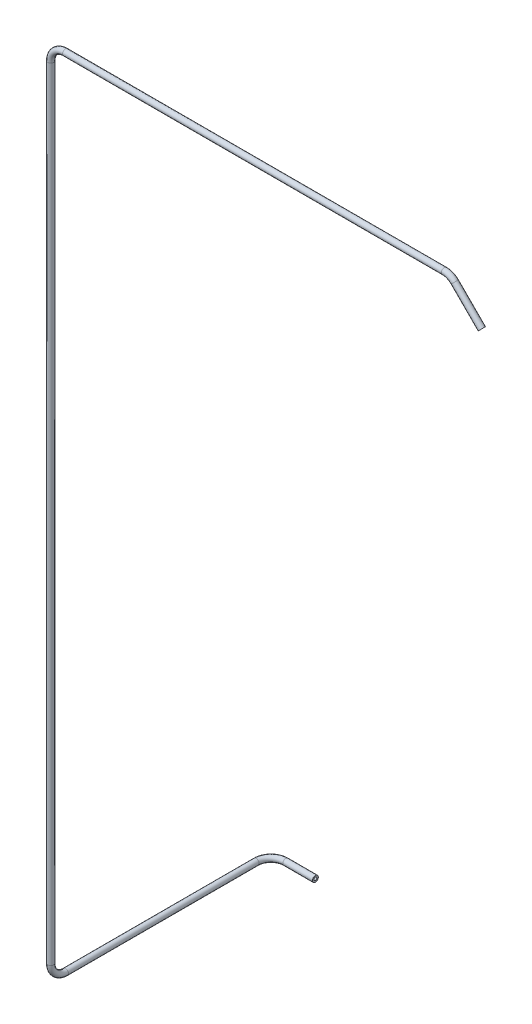
ISO-10303-21;
HEADER;
FILE_DESCRIPTION(('STEP AP214'),'2;1');
FILE_NAME('part.step','',(''),(''),'','','');
FILE_SCHEMA(('AUTOMOTIVE_DESIGN { 1 0 10303 214 1 1 1 1 }'));
ENDSEC;
DATA;
#1=APPLICATION_CONTEXT('core data for automotive mechanical design processes');
#2=APPLICATION_PROTOCOL_DEFINITION('international standard','automotive_design',2000,#1);
#3=PRODUCT_CONTEXT('',#1,'mechanical');
#4=PRODUCT('Part','Part','',(#3));
#5=PRODUCT_RELATED_PRODUCT_CATEGORY('part','',(#4));
#6=PRODUCT_DEFINITION_FORMATION('','',#4);
#7=PRODUCT_DEFINITION_CONTEXT('part definition',#1,'design');
#8=PRODUCT_DEFINITION('design','',#6,#7);
#9=PRODUCT_DEFINITION_SHAPE('','',#8);
#10=(LENGTH_UNIT() NAMED_UNIT(*) SI_UNIT(.MILLI.,.METRE.));
#11=(NAMED_UNIT(*) PLANE_ANGLE_UNIT() SI_UNIT($,.RADIAN.));
#12=(NAMED_UNIT(*) SI_UNIT($,.STERADIAN.) SOLID_ANGLE_UNIT());
#13=UNCERTAINTY_MEASURE_WITH_UNIT(LENGTH_MEASURE(1.E-05),#10,'distance_accuracy_value','');
#14=(GEOMETRIC_REPRESENTATION_CONTEXT(3) GLOBAL_UNCERTAINTY_ASSIGNED_CONTEXT((#13)) GLOBAL_UNIT_ASSIGNED_CONTEXT((#10,
#11,#12)) REPRESENTATION_CONTEXT('',''));
#15=CARTESIAN_POINT('',(0.,0.,0.));
#16=DIRECTION('',(0.,0.,1.));
#17=DIRECTION('',(1.,0.,0.));
#18=AXIS2_PLACEMENT_3D('',#15,#16,#17);
#19=CARTESIAN_POINT('',(0.,0.,0.));
#20=DIRECTION('',(-0.707106781186549,0.707106781186546,0.));
#21=DIRECTION('',(-0.707106781186546,-0.707106781186549,0.));
#22=AXIS2_PLACEMENT_3D('',#19,#20,#21);
#23=CYLINDRICAL_SURFACE('',#22,2.);
#24=CARTESIAN_POINT('',(-18.2842712474619,18.2842712474619,0.));
#25=DIRECTION('',(-0.707106781186549,0.707106781186546,0.));
#26=DIRECTION('',(-0.707106781186546,-0.707106781186549,0.));
#27=AXIS2_PLACEMENT_3D('',#24,#25,#26);
#28=CIRCLE('',#27,2.);
#29=CARTESIAN_POINT('',(-16.8700576850889,19.698484809835,0.));
#30=VERTEX_POINT('',#29);
#31=EDGE_CURVE('E64',#30,#30,#28,.T.);
#32=ORIENTED_EDGE('',*,*,#31,.F.);
#33=EDGE_LOOP('',(#32));
#34=FACE_BOUND('',#33,.T.);
#35=CARTESIAN_POINT('',(0.,0.,0.));
#36=DIRECTION('',(-0.707106781186549,0.707106781186546,0.));
#37=DIRECTION('',(-0.707106781186546,-0.707106781186549,0.));
#38=AXIS2_PLACEMENT_3D('',#35,#36,#37);
#39=CIRCLE('',#38,2.);
#40=CARTESIAN_POINT('',(-1.41421356237309,-1.4142135623731,0.));
#41=VERTEX_POINT('',#40);
#42=EDGE_CURVE('E60',#41,#41,#39,.T.);
#43=ORIENTED_EDGE('',*,*,#42,.T.);
#44=EDGE_LOOP('',(#43));
#45=FACE_BOUND('',#44,.T.);
#46=ADVANCED_FACE('F36',(#34,#45),#23,.T.);
#47=CARTESIAN_POINT('',(-25.3553390593274,11.2132034355964,0.));
#48=DIRECTION('',(0.,0.,1.));
#49=DIRECTION('',(1.,0.,0.));
#50=AXIS2_PLACEMENT_3D('',#47,#48,#49);
#51=TOROIDAL_SURFACE('',#50,10.,2.);
#52=CARTESIAN_POINT('',(-25.3553390593274,21.2132034355964,0.));
#53=DIRECTION('',(-1.,0.,0.));
#54=DIRECTION('',(0.,-1.,0.));
#55=AXIS2_PLACEMENT_3D('',#52,#53,#54);
#56=CIRCLE('',#55,2.);
#57=CARTESIAN_POINT('',(-25.3553390593274,23.2132034355964,0.));
#58=VERTEX_POINT('',#57);
#59=EDGE_CURVE('E68',#58,#58,#56,.T.);
#60=CARTESIAN_POINT('',(-25.3553390593274,11.2132034355964,0.));
#61=DIRECTION('',(0.,0.,1.));
#62=DIRECTION('',(1.,0.,0.));
#63=AXIS2_PLACEMENT_3D('',#60,#61,#62);
#64=CIRCLE('',#63,12.);
#65=EDGE_CURVE('',#30,#58,#64,.T.);
#66=ORIENTED_EDGE('',*,*,#31,.T.);
#67=ORIENTED_EDGE('',*,*,#59,.F.);
#68=ORIENTED_EDGE('',*,*,#65,.T.);
#69=ORIENTED_EDGE('',*,*,#65,.F.);
#70=EDGE_LOOP('',(#66,#68,#67,#69));
#71=FACE_BOUND('',#70,.T.);
#72=ADVANCED_FACE('F132',(#71),#51,.T.);
#73=CARTESIAN_POINT('',(-25.3553390593274,21.2132034355964,0.));
#74=DIRECTION('',(-1.,0.,0.));
#75=DIRECTION('',(0.,0.,1.));
#76=AXIS2_PLACEMENT_3D('',#73,#74,#75);
#77=CYLINDRICAL_SURFACE('',#76,2.);
#78=CARTESIAN_POINT('',(-281.213203435597,21.2132034355964,0.));
#79=DIRECTION('',(-1.,0.,0.));
#80=DIRECTION('',(0.,-1.,0.));
#81=AXIS2_PLACEMENT_3D('',#78,#79,#80);
#82=CIRCLE('',#81,2.);
#83=CARTESIAN_POINT('',(-281.213203435597,23.2132034355964,0.));
#84=VERTEX_POINT('',#83);
#85=EDGE_CURVE('E72',#84,#84,#82,.T.);
#86=ORIENTED_EDGE('',*,*,#85,.F.);
#87=EDGE_LOOP('',(#86));
#88=FACE_BOUND('',#87,.T.);
#89=ORIENTED_EDGE('',*,*,#59,.T.);
#90=EDGE_LOOP('',(#89));
#91=FACE_BOUND('',#90,.T.);
#92=ADVANCED_FACE('F136',(#88,#91),#77,.T.);
#93=CARTESIAN_POINT('',(-281.213203435597,11.2132034355964,0.));
#94=DIRECTION('',(0.,0.,1.));
#95=DIRECTION('',(1.,0.,0.));
#96=AXIS2_PLACEMENT_3D('',#93,#94,#95);
#97=TOROIDAL_SURFACE('',#96,10.,2.);
#98=CARTESIAN_POINT('',(-291.213203435597,11.2132034355964,0.));
#99=DIRECTION('',(0.,-1.,0.));
#100=DIRECTION('',(1.,0.,0.));
#101=AXIS2_PLACEMENT_3D('',#98,#99,#100);
#102=CIRCLE('',#101,2.);
#103=CARTESIAN_POINT('',(-293.213203435597,11.2132034355964,0.));
#104=VERTEX_POINT('',#103);
#105=EDGE_CURVE('E76',#104,#104,#102,.T.);
#106=CARTESIAN_POINT('',(-281.213203435597,11.2132034355964,0.));
#107=DIRECTION('',(0.,0.,1.));
#108=DIRECTION('',(1.,0.,0.));
#109=AXIS2_PLACEMENT_3D('',#106,#107,#108);
#110=CIRCLE('',#109,12.);
#111=EDGE_CURVE('',#84,#104,#110,.T.);
#112=ORIENTED_EDGE('',*,*,#85,.T.);
#113=ORIENTED_EDGE('',*,*,#105,.F.);
#114=ORIENTED_EDGE('',*,*,#111,.T.);
#115=ORIENTED_EDGE('',*,*,#111,.F.);
#116=EDGE_LOOP('',(#112,#114,#113,#115));
#117=FACE_BOUND('',#116,.T.);
#118=ADVANCED_FACE('F140',(#117),#97,.T.);
#119=CARTESIAN_POINT('',(-291.213203435597,11.2132034355964,0.));
#120=DIRECTION('',(0.,-1.,0.));
#121=DIRECTION('',(0.,0.,-1.));
#122=AXIS2_PLACEMENT_3D('',#119,#120,#121);
#123=CYLINDRICAL_SURFACE('',#122,2.);
#124=CARTESIAN_POINT('',(-291.213203435597,-516.706796564404,0.));
#125=DIRECTION('',(0.,-1.,0.));
#126=DIRECTION('',(1.,0.,0.));
#127=AXIS2_PLACEMENT_3D('',#124,#125,#126);
#128=CIRCLE('',#127,2.);
#129=CARTESIAN_POINT('',(-291.213203435597,-516.706796564404,2.));
#130=VERTEX_POINT('',#129);
#131=EDGE_CURVE('E80',#130,#130,#128,.T.);
#132=ORIENTED_EDGE('',*,*,#131,.F.);
#133=EDGE_LOOP('',(#132));
#134=FACE_BOUND('',#133,.T.);
#135=ORIENTED_EDGE('',*,*,#105,.T.);
#136=EDGE_LOOP('',(#135));
#137=FACE_BOUND('',#136,.T.);
#138=ADVANCED_FACE('F144',(#134,#137),#123,.T.);
#139=CARTESIAN_POINT('',(-291.213203435597,-516.706796564404,-10.));
#140=DIRECTION('',(1.,0.,0.));
#141=DIRECTION('',(0.,0.,-1.));
#142=AXIS2_PLACEMENT_3D('',#139,#140,#141);
#143=TOROIDAL_SURFACE('',#142,10.,2.);
#144=CARTESIAN_POINT('',(-291.213203435597,-526.706796564404,-10.));
#145=DIRECTION('',(0.,0.,-1.));
#146=DIRECTION('',(1.,0.,0.));
#147=AXIS2_PLACEMENT_3D('',#144,#145,#146);
#148=CIRCLE('',#147,2.);
#149=CARTESIAN_POINT('',(-291.213203435597,-528.706796564404,-10.));
#150=VERTEX_POINT('',#149);
#151=EDGE_CURVE('E84',#150,#150,#148,.T.);
#152=CARTESIAN_POINT('',(-291.213203435597,-516.706796564404,-10.));
#153=DIRECTION('',(1.,0.,0.));
#154=DIRECTION('',(0.,0.,-1.));
#155=AXIS2_PLACEMENT_3D('',#152,#153,#154);
#156=CIRCLE('',#155,12.);
#157=EDGE_CURVE('',#130,#150,#156,.T.);
#158=ORIENTED_EDGE('',*,*,#131,.T.);
#159=ORIENTED_EDGE('',*,*,#151,.F.);
#160=ORIENTED_EDGE('',*,*,#157,.T.);
#161=ORIENTED_EDGE('',*,*,#157,.F.);
#162=EDGE_LOOP('',(#158,#160,#159,#161));
#163=FACE_BOUND('',#162,.T.);
#164=ADVANCED_FACE('F106',(#163),#143,.T.);
#165=CARTESIAN_POINT('',(-291.213203435597,-526.706796564404,-10.));
#166=DIRECTION('',(0.,0.,-1.));
#167=DIRECTION('',(-1.,0.,0.));
#168=AXIS2_PLACEMENT_3D('',#165,#166,#167);
#169=CYLINDRICAL_SURFACE('',#168,2.);
#170=CARTESIAN_POINT('',(-291.213203435597,-526.706796564404,-138.77));
#171=DIRECTION('',(0.,0.,-1.));
#172=DIRECTION('',(1.,0.,0.));
#173=AXIS2_PLACEMENT_3D('',#170,#171,#172);
#174=CIRCLE('',#173,2.);
#175=CARTESIAN_POINT('',(-293.213203435597,-526.706796564404,-138.77));
#176=VERTEX_POINT('',#175);
#177=EDGE_CURVE('E87',#176,#176,#174,.T.);
#178=ORIENTED_EDGE('',*,*,#177,.F.);
#179=EDGE_LOOP('',(#178));
#180=FACE_BOUND('',#179,.T.);
#181=ORIENTED_EDGE('',*,*,#151,.T.);
#182=EDGE_LOOP('',(#181));
#183=FACE_BOUND('',#182,.T.);
#184=ADVANCED_FACE('F99',(#180,#183),#169,.T.);
#185=CARTESIAN_POINT('',(-281.213203435597,-526.706796564404,-138.77));
#186=DIRECTION('',(0.,-1.,0.));
#187=DIRECTION('',(0.,0.,-1.));
#188=AXIS2_PLACEMENT_3D('',#185,#186,#187);
#189=TOROIDAL_SURFACE('',#188,10.,2.);
#190=CARTESIAN_POINT('',(-281.213203435597,-526.706796564404,-148.77));
#191=DIRECTION('',(1.,0.,0.));
#192=DIRECTION('',(0.,0.,1.));
#193=AXIS2_PLACEMENT_3D('',#190,#191,#192);
#194=CIRCLE('',#193,2.);
#195=CARTESIAN_POINT('',(-281.213203435597,-526.706796564404,-150.77));
#196=VERTEX_POINT('',#195);
#197=EDGE_CURVE('E40',#196,#196,#194,.T.);
#198=CARTESIAN_POINT('',(-281.213203435597,-526.706796564404,-138.77));
#199=DIRECTION('',(0.,-1.,0.));
#200=DIRECTION('',(0.,0.,-1.));
#201=AXIS2_PLACEMENT_3D('',#198,#199,#200);
#202=CIRCLE('',#201,12.);
#203=EDGE_CURVE('',#176,#196,#202,.T.);
#204=ORIENTED_EDGE('',*,*,#177,.T.);
#205=ORIENTED_EDGE('',*,*,#197,.F.);
#206=ORIENTED_EDGE('',*,*,#203,.T.);
#207=ORIENTED_EDGE('',*,*,#203,.F.);
#208=EDGE_LOOP('',(#204,#206,#205,#207));
#209=FACE_BOUND('',#208,.T.);
#210=ADVANCED_FACE('F97',(#209),#189,.T.);
#211=CARTESIAN_POINT('',(-281.213203435597,-526.706796564404,-148.77));
#212=DIRECTION('',(1.,0.,0.));
#213=DIRECTION('',(0.,0.,-1.));
#214=AXIS2_PLACEMENT_3D('',#211,#212,#213);
#215=CYLINDRICAL_SURFACE('',#214,2.);
#216=CARTESIAN_POINT('',(-261.213203435596,-526.706796564404,-148.77));
#217=DIRECTION('',(1.,0.,0.));
#218=DIRECTION('',(0.,0.,1.));
#219=AXIS2_PLACEMENT_3D('',#216,#217,#218);
#220=CIRCLE('',#219,2.);
#221=CARTESIAN_POINT('',(-261.213203435596,-526.706796564404,-146.77));
#222=VERTEX_POINT('',#221);
#223=EDGE_CURVE('E55',#222,#222,#220,.T.);
#224=ORIENTED_EDGE('',*,*,#223,.F.);
#225=EDGE_LOOP('',(#224));
#226=FACE_BOUND('',#225,.T.);
#227=ORIENTED_EDGE('',*,*,#197,.T.);
#228=EDGE_LOOP('',(#227));
#229=FACE_BOUND('',#228,.T.);
#230=ADVANCED_FACE('F38',(#226,#229),#215,.T.);
#231=CARTESIAN_POINT('',(0.,0.,0.));
#232=DIRECTION('',(-0.707106781186549,0.707106781186546,0.));
#233=DIRECTION('',(-0.707106781186546,-0.707106781186549,0.));
#234=AXIS2_PLACEMENT_3D('',#231,#232,#233);
#235=PLANE('',#234);
#236=CARTESIAN_POINT('',(0.,0.,0.));
#237=DIRECTION('',(-0.707106781186549,0.707106781186546,0.));
#238=DIRECTION('',(-0.707106781186546,-0.707106781186549,0.));
#239=AXIS2_PLACEMENT_3D('',#236,#237,#238);
#240=CIRCLE('',#239,1.);
#241=CARTESIAN_POINT('',(-0.707106781186546,-0.707106781186549,0.));
#242=VERTEX_POINT('',#241);
#243=EDGE_CURVE('E59',#242,#242,#240,.F.);
#244=ORIENTED_EDGE('',*,*,#243,.F.);
#245=EDGE_LOOP('',(#244));
#246=FACE_BOUND('',#245,.T.);
#247=ORIENTED_EDGE('',*,*,#42,.F.);
#248=EDGE_LOOP('',(#247));
#249=FACE_BOUND('',#248,.T.);
#250=ADVANCED_FACE('F104',(#246,#249),#235,.F.);
#251=CARTESIAN_POINT('',(-261.213203435596,-526.706796564404,-148.77));
#252=DIRECTION('',(1.,0.,0.));
#253=DIRECTION('',(0.,0.,1.));
#254=AXIS2_PLACEMENT_3D('',#251,#252,#253);
#255=PLANE('',#254);
#256=CARTESIAN_POINT('',(-261.213203435596,-526.706796564404,-148.77));
#257=DIRECTION('',(1.,0.,0.));
#258=DIRECTION('',(0.,0.,1.));
#259=AXIS2_PLACEMENT_3D('',#256,#257,#258);
#260=CIRCLE('',#259,1.);
#261=CARTESIAN_POINT('',(-261.213203435596,-526.706796564404,-147.77));
#262=VERTEX_POINT('',#261);
#263=EDGE_CURVE('E10',#262,#262,#260,.F.);
#264=ORIENTED_EDGE('',*,*,#263,.T.);
#265=EDGE_LOOP('',(#264));
#266=FACE_BOUND('',#265,.T.);
#267=ORIENTED_EDGE('',*,*,#223,.T.);
#268=EDGE_LOOP('',(#267));
#269=FACE_BOUND('',#268,.T.);
#270=ADVANCED_FACE('F123',(#266,#269),#255,.T.);
#271=CARTESIAN_POINT('',(0.,0.,0.));
#272=DIRECTION('',(-0.707106781186549,0.707106781186546,0.));
#273=DIRECTION('',(-0.707106781186546,-0.707106781186549,0.));
#274=AXIS2_PLACEMENT_3D('',#271,#272,#273);
#275=CYLINDRICAL_SURFACE('',#274,1.);
#276=CARTESIAN_POINT('',(-18.2842712474619,18.2842712474619,0.));
#277=DIRECTION('',(-0.707106781186549,0.707106781186546,0.));
#278=DIRECTION('',(-0.707106781186546,-0.707106781186549,0.));
#279=AXIS2_PLACEMENT_3D('',#276,#277,#278);
#280=CIRCLE('',#279,1.);
#281=CARTESIAN_POINT('',(-17.5771644662754,18.9913780286484,0.));
#282=VERTEX_POINT('',#281);
#283=EDGE_CURVE('E303',#282,#282,#280,.F.);
#284=ORIENTED_EDGE('',*,*,#283,.F.);
#285=EDGE_LOOP('',(#284));
#286=FACE_BOUND('',#285,.T.);
#287=ORIENTED_EDGE('',*,*,#243,.T.);
#288=EDGE_LOOP('',(#287));
#289=FACE_BOUND('',#288,.T.);
#290=ADVANCED_FACE('F126',(#286,#289),#275,.F.);
#291=CARTESIAN_POINT('',(-25.3553390593274,11.2132034355964,0.));
#292=DIRECTION('',(0.,0.,1.));
#293=DIRECTION('',(1.,0.,0.));
#294=AXIS2_PLACEMENT_3D('',#291,#292,#293);
#295=TOROIDAL_SURFACE('',#294,10.,1.);
#296=CARTESIAN_POINT('',(-25.3553390593274,21.2132034355964,0.));
#297=DIRECTION('',(-1.,0.,0.));
#298=DIRECTION('',(0.,-1.,0.));
#299=AXIS2_PLACEMENT_3D('',#296,#297,#298);
#300=CIRCLE('',#299,1.);
#301=CARTESIAN_POINT('',(-25.3553390593274,22.2132034355964,0.));
#302=VERTEX_POINT('',#301);
#303=EDGE_CURVE('E299',#302,#302,#300,.F.);
#304=CARTESIAN_POINT('',(-25.3553390593274,11.2132034355964,0.));
#305=DIRECTION('',(0.,0.,1.));
#306=DIRECTION('',(1.,0.,0.));
#307=AXIS2_PLACEMENT_3D('',#304,#305,#306);
#308=CIRCLE('',#307,11.);
#309=EDGE_CURVE('',#282,#302,#308,.T.);
#310=ORIENTED_EDGE('',*,*,#283,.T.);
#311=ORIENTED_EDGE('',*,*,#303,.F.);
#312=ORIENTED_EDGE('',*,*,#309,.T.);
#313=ORIENTED_EDGE('',*,*,#309,.F.);
#314=EDGE_LOOP('',(#310,#312,#311,#313));
#315=FACE_BOUND('',#314,.T.);
#316=ADVANCED_FACE('F205',(#315),#295,.F.);
#317=CARTESIAN_POINT('',(-25.3553390593274,21.2132034355964,0.));
#318=DIRECTION('',(-1.,0.,0.));
#319=DIRECTION('',(0.,0.,1.));
#320=AXIS2_PLACEMENT_3D('',#317,#318,#319);
#321=CYLINDRICAL_SURFACE('',#320,1.);
#322=CARTESIAN_POINT('',(-281.213203435597,21.2132034355964,0.));
#323=DIRECTION('',(-1.,0.,0.));
#324=DIRECTION('',(0.,-1.,0.));
#325=AXIS2_PLACEMENT_3D('',#322,#323,#324);
#326=CIRCLE('',#325,1.);
#327=CARTESIAN_POINT('',(-281.213203435597,22.2132034355964,0.));
#328=VERTEX_POINT('',#327);
#329=EDGE_CURVE('E295',#328,#328,#326,.F.);
#330=ORIENTED_EDGE('',*,*,#329,.F.);
#331=EDGE_LOOP('',(#330));
#332=FACE_BOUND('',#331,.T.);
#333=ORIENTED_EDGE('',*,*,#303,.T.);
#334=EDGE_LOOP('',(#333));
#335=FACE_BOUND('',#334,.T.);
#336=ADVANCED_FACE('F215',(#332,#335),#321,.F.);
#337=CARTESIAN_POINT('',(-281.213203435597,11.2132034355964,0.));
#338=DIRECTION('',(0.,0.,1.));
#339=DIRECTION('',(1.,0.,0.));
#340=AXIS2_PLACEMENT_3D('',#337,#338,#339);
#341=TOROIDAL_SURFACE('',#340,10.,1.);
#342=CARTESIAN_POINT('',(-291.213203435597,11.2132034355964,0.));
#343=DIRECTION('',(0.,-1.,0.));
#344=DIRECTION('',(1.,0.,0.));
#345=AXIS2_PLACEMENT_3D('',#342,#343,#344);
#346=CIRCLE('',#345,1.);
#347=CARTESIAN_POINT('',(-292.213203435597,11.2132034355964,0.));
#348=VERTEX_POINT('',#347);
#349=EDGE_CURVE('E289',#348,#348,#346,.F.);
#350=CARTESIAN_POINT('',(-281.213203435597,11.2132034355964,0.));
#351=DIRECTION('',(0.,0.,1.));
#352=DIRECTION('',(1.,0.,0.));
#353=AXIS2_PLACEMENT_3D('',#350,#351,#352);
#354=CIRCLE('',#353,11.);
#355=EDGE_CURVE('',#328,#348,#354,.T.);
#356=ORIENTED_EDGE('',*,*,#329,.T.);
#357=ORIENTED_EDGE('',*,*,#349,.F.);
#358=ORIENTED_EDGE('',*,*,#355,.T.);
#359=ORIENTED_EDGE('',*,*,#355,.F.);
#360=EDGE_LOOP('',(#356,#358,#357,#359));
#361=FACE_BOUND('',#360,.T.);
#362=ADVANCED_FACE('F225',(#361),#341,.F.);
#363=CARTESIAN_POINT('',(-291.213203435597,11.2132034355964,0.));
#364=DIRECTION('',(0.,-1.,0.));
#365=DIRECTION('',(0.,0.,-1.));
#366=AXIS2_PLACEMENT_3D('',#363,#364,#365);
#367=CYLINDRICAL_SURFACE('',#366,1.);
#368=CARTESIAN_POINT('',(-291.213203435597,-516.706796564404,0.));
#369=DIRECTION('',(0.,-1.,0.));
#370=DIRECTION('',(1.,0.,0.));
#371=AXIS2_PLACEMENT_3D('',#368,#369,#370);
#372=CIRCLE('',#371,1.);
#373=CARTESIAN_POINT('',(-291.213203435597,-516.706796564404,1.));
#374=VERTEX_POINT('',#373);
#375=EDGE_CURVE('E284',#374,#374,#372,.F.);
#376=ORIENTED_EDGE('',*,*,#375,.F.);
#377=EDGE_LOOP('',(#376));
#378=FACE_BOUND('',#377,.T.);
#379=ORIENTED_EDGE('',*,*,#349,.T.);
#380=EDGE_LOOP('',(#379));
#381=FACE_BOUND('',#380,.T.);
#382=ADVANCED_FACE('F235',(#378,#381),#367,.F.);
#383=CARTESIAN_POINT('',(-291.213203435597,-516.706796564404,-10.));
#384=DIRECTION('',(1.,0.,0.));
#385=DIRECTION('',(0.,0.,-1.));
#386=AXIS2_PLACEMENT_3D('',#383,#384,#385);
#387=TOROIDAL_SURFACE('',#386,10.,1.);
#388=CARTESIAN_POINT('',(-291.213203435597,-526.706796564404,-10.));
#389=DIRECTION('',(0.,0.,-1.));
#390=DIRECTION('',(1.,0.,0.));
#391=AXIS2_PLACEMENT_3D('',#388,#389,#390);
#392=CIRCLE('',#391,1.);
#393=CARTESIAN_POINT('',(-291.213203435597,-527.706796564404,-10.));
#394=VERTEX_POINT('',#393);
#395=EDGE_CURVE('E282',#394,#394,#392,.F.);
#396=CARTESIAN_POINT('',(-291.213203435597,-516.706796564404,-10.));
#397=DIRECTION('',(1.,0.,0.));
#398=DIRECTION('',(0.,0.,-1.));
#399=AXIS2_PLACEMENT_3D('',#396,#397,#398);
#400=CIRCLE('',#399,11.);
#401=EDGE_CURVE('',#374,#394,#400,.T.);
#402=ORIENTED_EDGE('',*,*,#375,.T.);
#403=ORIENTED_EDGE('',*,*,#395,.F.);
#404=ORIENTED_EDGE('',*,*,#401,.T.);
#405=ORIENTED_EDGE('',*,*,#401,.F.);
#406=EDGE_LOOP('',(#402,#404,#403,#405));
#407=FACE_BOUND('',#406,.T.);
#408=ADVANCED_FACE('F245',(#407),#387,.F.);
#409=CARTESIAN_POINT('',(-291.213203435597,-526.706796564404,-10.));
#410=DIRECTION('',(0.,0.,-1.));
#411=DIRECTION('',(-1.,0.,0.));
#412=AXIS2_PLACEMENT_3D('',#409,#410,#411);
#413=CYLINDRICAL_SURFACE('',#412,1.);
#414=CARTESIAN_POINT('',(-291.213203435597,-526.706796564404,-138.77));
#415=DIRECTION('',(0.,0.,-1.));
#416=DIRECTION('',(1.,0.,0.));
#417=AXIS2_PLACEMENT_3D('',#414,#415,#416);
#418=CIRCLE('',#417,1.);
#419=CARTESIAN_POINT('',(-292.213203435597,-526.706796564404,-138.77));
#420=VERTEX_POINT('',#419);
#421=EDGE_CURVE('E51',#420,#420,#418,.F.);
#422=ORIENTED_EDGE('',*,*,#421,.F.);
#423=EDGE_LOOP('',(#422));
#424=FACE_BOUND('',#423,.T.);
#425=ORIENTED_EDGE('',*,*,#395,.T.);
#426=EDGE_LOOP('',(#425));
#427=FACE_BOUND('',#426,.T.);
#428=ADVANCED_FACE('F117',(#424,#427),#413,.F.);
#429=CARTESIAN_POINT('',(-281.213203435597,-526.706796564404,-138.77));
#430=DIRECTION('',(0.,-1.,0.));
#431=DIRECTION('',(0.,0.,-1.));
#432=AXIS2_PLACEMENT_3D('',#429,#430,#431);
#433=TOROIDAL_SURFACE('',#432,10.,1.);
#434=CARTESIAN_POINT('',(-281.213203435597,-526.706796564404,-148.77));
#435=DIRECTION('',(1.,0.,0.));
#436=DIRECTION('',(0.,0.,1.));
#437=AXIS2_PLACEMENT_3D('',#434,#435,#436);
#438=CIRCLE('',#437,1.);
#439=CARTESIAN_POINT('',(-281.213203435597,-526.706796564404,-149.77));
#440=VERTEX_POINT('',#439);
#441=EDGE_CURVE('E45',#440,#440,#438,.F.);
#442=CARTESIAN_POINT('',(-281.213203435597,-526.706796564404,-138.77));
#443=DIRECTION('',(0.,-1.,0.));
#444=DIRECTION('',(0.,0.,-1.));
#445=AXIS2_PLACEMENT_3D('',#442,#443,#444);
#446=CIRCLE('',#445,11.);
#447=EDGE_CURVE('',#420,#440,#446,.T.);
#448=ORIENTED_EDGE('',*,*,#421,.T.);
#449=ORIENTED_EDGE('',*,*,#441,.F.);
#450=ORIENTED_EDGE('',*,*,#447,.T.);
#451=ORIENTED_EDGE('',*,*,#447,.F.);
#452=EDGE_LOOP('',(#448,#450,#449,#451));
#453=FACE_BOUND('',#452,.T.);
#454=ADVANCED_FACE('F111',(#453),#433,.F.);
#455=CARTESIAN_POINT('',(-281.213203435597,-526.706796564404,-148.77));
#456=DIRECTION('',(1.,0.,0.));
#457=DIRECTION('',(0.,0.,-1.));
#458=AXIS2_PLACEMENT_3D('',#455,#456,#457);
#459=CYLINDRICAL_SURFACE('',#458,1.);
#460=ORIENTED_EDGE('',*,*,#263,.F.);
#461=EDGE_LOOP('',(#460));
#462=FACE_BOUND('',#461,.T.);
#463=ORIENTED_EDGE('',*,*,#441,.T.);
#464=EDGE_LOOP('',(#463));
#465=FACE_BOUND('',#464,.T.);
#466=ADVANCED_FACE('F109',(#462,#465),#459,.F.);
#467=CLOSED_SHELL('',(#46,#72,#92,#118,#138,#164,#184,#210,#230,#250,#270,#290,#316,#336,#362,
#382,#408,#428,#454,#466));
#468=MANIFOLD_SOLID_BREP('B2',#467);
#469=ADVANCED_BREP_SHAPE_REPRESENTATION('',(#18,#468),#14);
#470=SHAPE_DEFINITION_REPRESENTATION(#9,#469);
ENDSEC;
END-ISO-10303-21;
